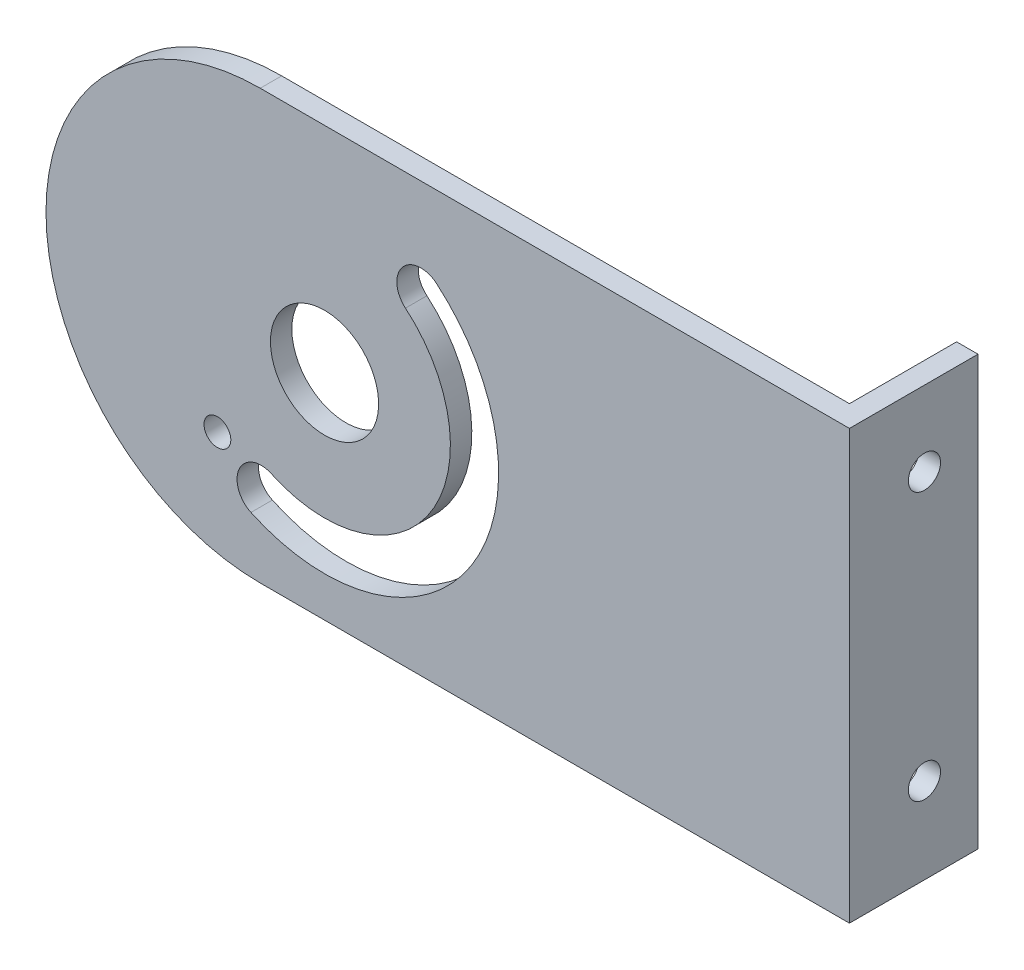
ISO-10303-21;
HEADER;
FILE_DESCRIPTION(('STEP AP214'),'2;1');
FILE_NAME('part.step','',(''),(''),'','','');
FILE_SCHEMA(('AUTOMOTIVE_DESIGN { 1 0 10303 214 1 1 1 1 }'));
ENDSEC;
DATA;
#1=APPLICATION_CONTEXT('core data for automotive mechanical design processes');
#2=APPLICATION_PROTOCOL_DEFINITION('international standard','automotive_design',2000,#1);
#3=PRODUCT_CONTEXT('',#1,'mechanical');
#4=PRODUCT('Part','Part','',(#3));
#5=PRODUCT_RELATED_PRODUCT_CATEGORY('part','',(#4));
#6=PRODUCT_DEFINITION_FORMATION('','',#4);
#7=PRODUCT_DEFINITION_CONTEXT('part definition',#1,'design');
#8=PRODUCT_DEFINITION('design','',#6,#7);
#9=PRODUCT_DEFINITION_SHAPE('','',#8);
#10=(LENGTH_UNIT() NAMED_UNIT(*) SI_UNIT(.MILLI.,.METRE.));
#11=(NAMED_UNIT(*) PLANE_ANGLE_UNIT() SI_UNIT($,.RADIAN.));
#12=(NAMED_UNIT(*) SI_UNIT($,.STERADIAN.) SOLID_ANGLE_UNIT());
#13=UNCERTAINTY_MEASURE_WITH_UNIT(LENGTH_MEASURE(1.E-05),#10,'distance_accuracy_value','');
#14=(GEOMETRIC_REPRESENTATION_CONTEXT(3) GLOBAL_UNCERTAINTY_ASSIGNED_CONTEXT((#13)) GLOBAL_UNIT_ASSIGNED_CONTEXT((#10,
#11,#12)) REPRESENTATION_CONTEXT('',''));
#15=CARTESIAN_POINT('',(0.,0.,0.));
#16=DIRECTION('',(0.,0.,1.));
#17=DIRECTION('',(1.,0.,0.));
#18=AXIS2_PLACEMENT_3D('',#15,#16,#17);
#19=CARTESIAN_POINT('',(75.,0.,2.));
#20=DIRECTION('',(0.,1.,0.));
#21=DIRECTION('',(-1.,0.,0.));
#22=AXIS2_PLACEMENT_3D('',#19,#20,#21);
#23=PLANE('',#22);
#24=DIRECTION('',(1.,0.,0.));
#25=VECTOR('',#24,1.);
#26=CARTESIAN_POINT('',(75.,0.,2.));
#27=LINE('',#26,#25);
#28=CARTESIAN_POINT('',(20.,0.,2.));
#29=VERTEX_POINT('',#28);
#30=CARTESIAN_POINT('',(75.,0.,2.));
#31=VERTEX_POINT('',#30);
#32=EDGE_CURVE('E212',#29,#31,#27,.T.);
#33=ORIENTED_EDGE('',*,*,#32,.F.);
#34=DIRECTION('',(0.,0.,-1.));
#35=VECTOR('',#34,1.);
#36=CARTESIAN_POINT('',(20.,0.,2.));
#37=LINE('',#36,#35);
#38=CARTESIAN_POINT('',(20.,0.,0.));
#39=VERTEX_POINT('',#38);
#40=EDGE_CURVE('E139',#29,#39,#37,.T.);
#41=ORIENTED_EDGE('',*,*,#40,.T.);
#42=DIRECTION('',(1.,0.,0.));
#43=VECTOR('',#42,1.);
#44=CARTESIAN_POINT('',(75.,0.,0.));
#45=LINE('',#44,#43);
#46=CARTESIAN_POINT('',(73.,0.,0.));
#47=VERTEX_POINT('',#46);
#48=EDGE_CURVE('E209',#39,#47,#45,.T.);
#49=ORIENTED_EDGE('',*,*,#48,.T.);
#50=DIRECTION('',(0.,0.,1.));
#51=VECTOR('',#50,1.);
#52=CARTESIAN_POINT('',(73.,0.,-10.));
#53=LINE('',#52,#51);
#54=CARTESIAN_POINT('',(73.,0.,-10.));
#55=VERTEX_POINT('',#54);
#56=EDGE_CURVE('E145',#55,#47,#53,.T.);
#57=ORIENTED_EDGE('',*,*,#56,.F.);
#58=DIRECTION('',(-1.,0.,0.));
#59=VECTOR('',#58,1.);
#60=CARTESIAN_POINT('',(75.,0.,-10.));
#61=LINE('',#60,#59);
#62=CARTESIAN_POINT('',(75.,0.,-10.));
#63=VERTEX_POINT('',#62);
#64=EDGE_CURVE('E144',#63,#55,#61,.T.);
#65=ORIENTED_EDGE('',*,*,#64,.F.);
#66=DIRECTION('',(0.,0.,-1.));
#67=VECTOR('',#66,1.);
#68=CARTESIAN_POINT('',(75.,0.,2.));
#69=LINE('',#68,#67);
#70=EDGE_CURVE('E128',#31,#63,#69,.T.);
#71=ORIENTED_EDGE('',*,*,#70,.F.);
#72=EDGE_LOOP('',(#33,#41,#49,#57,#65,#71));
#73=FACE_BOUND('',#72,.T.);
#74=ADVANCED_FACE('F43',(#73),#23,.F.);
#75=CARTESIAN_POINT('',(75.,40.,2.));
#76=DIRECTION('',(-1.,0.,0.));
#77=DIRECTION('',(0.,0.,1.));
#78=AXIS2_PLACEMENT_3D('',#75,#76,#77);
#79=PLANE('',#78);
#80=CARTESIAN_POINT('',(75.,33.,-5.));
#81=DIRECTION('',(-1.,0.,0.));
#82=DIRECTION('',(0.,0.,1.));
#83=AXIS2_PLACEMENT_3D('',#80,#81,#82);
#84=CIRCLE('',#83,1.5);
#85=CARTESIAN_POINT('',(75.,33.,-3.5));
#86=VERTEX_POINT('',#85);
#87=EDGE_CURVE('E154',#86,#86,#84,.T.);
#88=ORIENTED_EDGE('',*,*,#87,.T.);
#89=EDGE_LOOP('',(#88));
#90=FACE_BOUND('',#89,.T.);
#91=CARTESIAN_POINT('',(75.,8.,-5.));
#92=DIRECTION('',(-1.,0.,0.));
#93=DIRECTION('',(0.,0.,1.));
#94=AXIS2_PLACEMENT_3D('',#91,#92,#93);
#95=CIRCLE('',#94,1.5);
#96=CARTESIAN_POINT('',(75.,8.,-3.5));
#97=VERTEX_POINT('',#96);
#98=EDGE_CURVE('E160',#97,#97,#95,.T.);
#99=ORIENTED_EDGE('',*,*,#98,.T.);
#100=EDGE_LOOP('',(#99));
#101=FACE_BOUND('',#100,.T.);
#102=ORIENTED_EDGE('',*,*,#70,.T.);
#103=DIRECTION('',(0.,-1.,0.));
#104=VECTOR('',#103,1.);
#105=CARTESIAN_POINT('',(75.,0.,-10.));
#106=LINE('',#105,#104);
#107=CARTESIAN_POINT('',(75.,40.,-10.));
#108=VERTEX_POINT('',#107);
#109=EDGE_CURVE('E131',#108,#63,#106,.T.);
#110=ORIENTED_EDGE('',*,*,#109,.F.);
#111=DIRECTION('',(0.,0.,-1.));
#112=VECTOR('',#111,1.);
#113=CARTESIAN_POINT('',(75.,40.,2.));
#114=LINE('',#113,#112);
#115=CARTESIAN_POINT('',(75.,40.,2.));
#116=VERTEX_POINT('',#115);
#117=EDGE_CURVE('E136',#116,#108,#114,.T.);
#118=ORIENTED_EDGE('',*,*,#117,.F.);
#119=DIRECTION('',(0.,1.,0.));
#120=VECTOR('',#119,1.);
#121=CARTESIAN_POINT('',(75.,40.,2.));
#122=LINE('',#121,#120);
#123=EDGE_CURVE('E133',#31,#116,#122,.T.);
#124=ORIENTED_EDGE('',*,*,#123,.F.);
#125=EDGE_LOOP('',(#102,#110,#118,#124));
#126=FACE_BOUND('',#125,.T.);
#127=ADVANCED_FACE('F132',(#90,#101,#126),#79,.F.);
#128=CARTESIAN_POINT('',(0.,40.,2.));
#129=DIRECTION('',(0.,-1.,0.));
#130=DIRECTION('',(0.,0.,-1.));
#131=AXIS2_PLACEMENT_3D('',#128,#129,#130);
#132=PLANE('',#131);
#133=ORIENTED_EDGE('',*,*,#117,.T.);
#134=DIRECTION('',(1.,0.,0.));
#135=VECTOR('',#134,1.);
#136=CARTESIAN_POINT('',(75.,40.,-10.));
#137=LINE('',#136,#135);
#138=CARTESIAN_POINT('',(73.,40.,-10.));
#139=VERTEX_POINT('',#138);
#140=EDGE_CURVE('E155',#139,#108,#137,.T.);
#141=ORIENTED_EDGE('',*,*,#140,.F.);
#142=DIRECTION('',(0.,0.,1.));
#143=VECTOR('',#142,1.);
#144=CARTESIAN_POINT('',(73.,40.,-10.));
#145=LINE('',#144,#143);
#146=CARTESIAN_POINT('',(73.,40.,0.));
#147=VERTEX_POINT('',#146);
#148=EDGE_CURVE('E162',#139,#147,#145,.T.);
#149=ORIENTED_EDGE('',*,*,#148,.T.);
#150=DIRECTION('',(-1.,0.,0.));
#151=VECTOR('',#150,1.);
#152=CARTESIAN_POINT('',(0.,40.,0.));
#153=LINE('',#152,#151);
#154=CARTESIAN_POINT('',(20.,40.,0.));
#155=VERTEX_POINT('',#154);
#156=EDGE_CURVE('E214',#147,#155,#153,.T.);
#157=ORIENTED_EDGE('',*,*,#156,.T.);
#158=DIRECTION('',(0.,0.,-1.));
#159=VECTOR('',#158,1.);
#160=CARTESIAN_POINT('',(20.,40.,2.));
#161=LINE('',#160,#159);
#162=CARTESIAN_POINT('',(20.,40.,2.));
#163=VERTEX_POINT('',#162);
#164=EDGE_CURVE('E11',#155,#163,#161,.F.);
#165=ORIENTED_EDGE('',*,*,#164,.T.);
#166=DIRECTION('',(-1.,0.,0.));
#167=VECTOR('',#166,1.);
#168=CARTESIAN_POINT('',(0.,40.,2.));
#169=LINE('',#168,#167);
#170=EDGE_CURVE('E213',#116,#163,#169,.T.);
#171=ORIENTED_EDGE('',*,*,#170,.F.);
#172=EDGE_LOOP('',(#133,#141,#149,#157,#165,#171));
#173=FACE_BOUND('',#172,.T.);
#174=ADVANCED_FACE('F243',(#173),#132,.F.);
#175=CARTESIAN_POINT('',(0.,0.,2.));
#176=DIRECTION('',(0.,0.,-1.));
#177=DIRECTION('',(-1.,0.,0.));
#178=AXIS2_PLACEMENT_3D('',#175,#176,#177);
#179=PLANE('',#178);
#180=CARTESIAN_POINT('',(16.,10.2020410288673,2.));
#181=DIRECTION('',(0.,0.,-1.));
#182=DIRECTION('',(-1.,0.,0.));
#183=AXIS2_PLACEMENT_3D('',#180,#181,#182);
#184=CIRCLE('',#183,1.25);
#185=CARTESIAN_POINT('',(14.75,10.2020410288673,2.));
#186=VERTEX_POINT('',#185);
#187=EDGE_CURVE('E205',#186,#186,#184,.T.);
#188=ORIENTED_EDGE('',*,*,#187,.T.);
#189=EDGE_LOOP('',(#188));
#190=FACE_BOUND('',#189,.T.);
#191=CARTESIAN_POINT('',(26.,20.,2.));
#192=DIRECTION('',(0.,0.,1.));
#193=DIRECTION('',(-1.,0.,0.));
#194=AXIS2_PLACEMENT_3D('',#191,#192,#193);
#195=CIRCLE('',#194,11.75);
#196=CARTESIAN_POINT('',(21.0332687973885,9.35133430137817,2.));
#197=VERTEX_POINT('',#196);
#198=CARTESIAN_POINT('',(33.5535714285714,29.0003365866766,2.));
#199=VERTEX_POINT('',#198);
#200=EDGE_CURVE('E170',#197,#199,#195,.T.);
#201=ORIENTED_EDGE('',*,*,#200,.T.);
#202=CARTESIAN_POINT('',(35.,30.7238052947636,2.));
#203=DIRECTION('',(0.,0.,-1.));
#204=DIRECTION('',(-1.,0.,0.));
#205=AXIS2_PLACEMENT_3D('',#202,#203,#204);
#206=CIRCLE('',#205,2.25000000000001);
#207=CARTESIAN_POINT('',(36.4464285714286,32.4472740028506,2.));
#208=VERTEX_POINT('',#207);
#209=EDGE_CURVE('E183',#199,#208,#206,.T.);
#210=ORIENTED_EDGE('',*,*,#209,.T.);
#211=CARTESIAN_POINT('',(26.,20.,2.));
#212=DIRECTION('',(0.,0.,-1.));
#213=DIRECTION('',(-1.,0.,0.));
#214=AXIS2_PLACEMENT_3D('',#211,#212,#213);
#215=CIRCLE('',#214,16.25);
#216=CARTESIAN_POINT('',(19.1311164219202,5.27312190616129,2.));
#217=VERTEX_POINT('',#216);
#218=EDGE_CURVE('E194',#208,#217,#215,.T.);
#219=ORIENTED_EDGE('',*,*,#218,.T.);
#220=CARTESIAN_POINT('',(20.0821926096544,7.31222810376973,2.));
#221=DIRECTION('',(0.,0.,-1.));
#222=DIRECTION('',(-1.,0.,0.));
#223=AXIS2_PLACEMENT_3D('',#220,#221,#222);
#224=CIRCLE('',#223,2.25000000000001);
#225=EDGE_CURVE('E195',#217,#197,#224,.T.);
#226=ORIENTED_EDGE('',*,*,#225,.T.);
#227=EDGE_LOOP('',(#201,#210,#219,#226));
#228=FACE_BOUND('',#227,.T.);
#229=CARTESIAN_POINT('',(26.,20.,2.));
#230=DIRECTION('',(0.,0.,-1.));
#231=DIRECTION('',(-1.,0.,0.));
#232=AXIS2_PLACEMENT_3D('',#229,#230,#231);
#233=CIRCLE('',#232,5.05);
#234=CARTESIAN_POINT('',(20.95,20.,2.));
#235=VERTEX_POINT('',#234);
#236=EDGE_CURVE('E204',#235,#235,#233,.T.);
#237=ORIENTED_EDGE('',*,*,#236,.T.);
#238=EDGE_LOOP('',(#237));
#239=FACE_BOUND('',#238,.T.);
#240=CARTESIAN_POINT('',(20.,20.,2.));
#241=DIRECTION('',(0.,0.,-1.));
#242=DIRECTION('',(-1.,0.,0.));
#243=AXIS2_PLACEMENT_3D('',#240,#241,#242);
#244=CIRCLE('',#243,20.);
#245=CARTESIAN_POINT('',(0.,20.,2.));
#246=VERTEX_POINT('',#245);
#247=EDGE_CURVE('E69',#163,#246,#244,.F.);
#248=ORIENTED_EDGE('',*,*,#247,.T.);
#249=CARTESIAN_POINT('',(20.,20.,2.));
#250=DIRECTION('',(0.,0.,-1.));
#251=DIRECTION('',(-1.,0.,0.));
#252=AXIS2_PLACEMENT_3D('',#249,#250,#251);
#253=CIRCLE('',#252,20.);
#254=EDGE_CURVE('E55',#246,#29,#253,.F.);
#255=ORIENTED_EDGE('',*,*,#254,.T.);
#256=ORIENTED_EDGE('',*,*,#32,.T.);
#257=ORIENTED_EDGE('',*,*,#123,.T.);
#258=ORIENTED_EDGE('',*,*,#170,.T.);
#259=EDGE_LOOP('',(#248,#255,#256,#257,#258));
#260=FACE_BOUND('',#259,.T.);
#261=ADVANCED_FACE('F229',(#190,#228,#239,#260),#179,.F.);
#262=CARTESIAN_POINT('',(0.,0.,0.));
#263=DIRECTION('',(0.,0.,-1.));
#264=DIRECTION('',(-1.,0.,0.));
#265=AXIS2_PLACEMENT_3D('',#262,#263,#264);
#266=PLANE('',#265);
#267=DIRECTION('',(0.,1.,0.));
#268=VECTOR('',#267,1.);
#269=CARTESIAN_POINT('',(73.,0.,0.));
#270=LINE('',#269,#268);
#271=EDGE_CURVE('E56',#47,#147,#270,.T.);
#272=ORIENTED_EDGE('',*,*,#271,.F.);
#273=ORIENTED_EDGE('',*,*,#48,.F.);
#274=CARTESIAN_POINT('',(20.,20.,0.));
#275=DIRECTION('',(0.,0.,-1.));
#276=DIRECTION('',(-1.,0.,0.));
#277=AXIS2_PLACEMENT_3D('',#274,#275,#276);
#278=CIRCLE('',#277,20.);
#279=CARTESIAN_POINT('',(0.,20.,0.));
#280=VERTEX_POINT('',#279);
#281=EDGE_CURVE('E221',#39,#280,#278,.T.);
#282=ORIENTED_EDGE('',*,*,#281,.T.);
#283=CARTESIAN_POINT('',(20.,20.,0.));
#284=DIRECTION('',(0.,0.,-1.));
#285=DIRECTION('',(-1.,0.,0.));
#286=AXIS2_PLACEMENT_3D('',#283,#284,#285);
#287=CIRCLE('',#286,20.);
#288=EDGE_CURVE('E224',#280,#155,#287,.T.);
#289=ORIENTED_EDGE('',*,*,#288,.T.);
#290=ORIENTED_EDGE('',*,*,#156,.F.);
#291=EDGE_LOOP('',(#272,#273,#282,#289,#290));
#292=FACE_BOUND('',#291,.T.);
#293=CARTESIAN_POINT('',(16.,10.2020410288673,0.));
#294=DIRECTION('',(0.,0.,-1.));
#295=DIRECTION('',(-1.,0.,0.));
#296=AXIS2_PLACEMENT_3D('',#293,#294,#295);
#297=CIRCLE('',#296,1.25);
#298=CARTESIAN_POINT('',(14.75,10.2020410288673,0.));
#299=VERTEX_POINT('',#298);
#300=EDGE_CURVE('E178',#299,#299,#297,.T.);
#301=ORIENTED_EDGE('',*,*,#300,.F.);
#302=EDGE_LOOP('',(#301));
#303=FACE_BOUND('',#302,.T.);
#304=CARTESIAN_POINT('',(35.,30.7238052947636,0.));
#305=DIRECTION('',(0.,0.,-1.));
#306=DIRECTION('',(-1.,0.,0.));
#307=AXIS2_PLACEMENT_3D('',#304,#305,#306);
#308=CIRCLE('',#307,2.25000000000001);
#309=CARTESIAN_POINT('',(33.5535714285714,29.0003365866766,0.));
#310=VERTEX_POINT('',#309);
#311=CARTESIAN_POINT('',(36.4464285714286,32.4472740028506,0.));
#312=VERTEX_POINT('',#311);
#313=EDGE_CURVE('E190',#310,#312,#308,.T.);
#314=ORIENTED_EDGE('',*,*,#313,.F.);
#315=CARTESIAN_POINT('',(26.,20.,0.));
#316=DIRECTION('',(0.,0.,1.));
#317=DIRECTION('',(-1.,0.,0.));
#318=AXIS2_PLACEMENT_3D('',#315,#316,#317);
#319=CIRCLE('',#318,11.75);
#320=CARTESIAN_POINT('',(21.0332687973885,9.35133430137817,0.));
#321=VERTEX_POINT('',#320);
#322=EDGE_CURVE('E180',#321,#310,#319,.T.);
#323=ORIENTED_EDGE('',*,*,#322,.F.);
#324=CARTESIAN_POINT('',(20.0821926096544,7.31222810376973,0.));
#325=DIRECTION('',(0.,0.,-1.));
#326=DIRECTION('',(-1.,0.,0.));
#327=AXIS2_PLACEMENT_3D('',#324,#325,#326);
#328=CIRCLE('',#327,2.25000000000001);
#329=CARTESIAN_POINT('',(19.1311164219202,5.27312190616129,0.));
#330=VERTEX_POINT('',#329);
#331=EDGE_CURVE('E177',#330,#321,#328,.T.);
#332=ORIENTED_EDGE('',*,*,#331,.F.);
#333=CARTESIAN_POINT('',(26.,20.,0.));
#334=DIRECTION('',(0.,0.,-1.));
#335=DIRECTION('',(-1.,0.,0.));
#336=AXIS2_PLACEMENT_3D('',#333,#334,#335);
#337=CIRCLE('',#336,16.25);
#338=EDGE_CURVE('E185',#312,#330,#337,.T.);
#339=ORIENTED_EDGE('',*,*,#338,.F.);
#340=EDGE_LOOP('',(#314,#323,#332,#339));
#341=FACE_BOUND('',#340,.T.);
#342=CARTESIAN_POINT('',(26.,20.,0.));
#343=DIRECTION('',(0.,0.,-1.));
#344=DIRECTION('',(-1.,0.,0.));
#345=AXIS2_PLACEMENT_3D('',#342,#343,#344);
#346=CIRCLE('',#345,5.05);
#347=CARTESIAN_POINT('',(20.95,20.,0.));
#348=VERTEX_POINT('',#347);
#349=EDGE_CURVE('E189',#348,#348,#346,.T.);
#350=ORIENTED_EDGE('',*,*,#349,.F.);
#351=EDGE_LOOP('',(#350));
#352=FACE_BOUND('',#351,.T.);
#353=ADVANCED_FACE('F233',(#292,#303,#341,#352),#266,.T.);
#354=CARTESIAN_POINT('',(26.,20.,2.));
#355=DIRECTION('',(0.,0.,-1.));
#356=DIRECTION('',(-1.,0.,0.));
#357=AXIS2_PLACEMENT_3D('',#354,#355,#356);
#358=CYLINDRICAL_SURFACE('',#357,5.05);
#359=ORIENTED_EDGE('',*,*,#236,.F.);
#360=EDGE_LOOP('',(#359));
#361=FACE_BOUND('',#360,.T.);
#362=ORIENTED_EDGE('',*,*,#349,.T.);
#363=EDGE_LOOP('',(#362));
#364=FACE_BOUND('',#363,.T.);
#365=ADVANCED_FACE('F269',(#361,#364),#358,.F.);
#366=CARTESIAN_POINT('',(35.,30.7238052947636,2.));
#367=DIRECTION('',(0.,0.,-1.));
#368=DIRECTION('',(-1.,0.,0.));
#369=AXIS2_PLACEMENT_3D('',#366,#367,#368);
#370=CYLINDRICAL_SURFACE('',#369,2.25000000000001);
#371=ORIENTED_EDGE('',*,*,#313,.T.);
#372=DIRECTION('',(0.,0.,-1.));
#373=VECTOR('',#372,1.);
#374=CARTESIAN_POINT('',(36.4464285714286,32.4472740028506,2.));
#375=LINE('',#374,#373);
#376=EDGE_CURVE('E168',#208,#312,#375,.T.);
#377=ORIENTED_EDGE('',*,*,#376,.F.);
#378=ORIENTED_EDGE('',*,*,#209,.F.);
#379=DIRECTION('',(0.,0.,-1.));
#380=VECTOR('',#379,1.);
#381=CARTESIAN_POINT('',(33.5535714285714,29.0003365866766,2.));
#382=LINE('',#381,#380);
#383=EDGE_CURVE('E175',#199,#310,#382,.T.);
#384=ORIENTED_EDGE('',*,*,#383,.T.);
#385=EDGE_LOOP('',(#371,#377,#378,#384));
#386=FACE_BOUND('',#385,.T.);
#387=ADVANCED_FACE('F276',(#386),#370,.F.);
#388=CARTESIAN_POINT('',(26.,20.,2.));
#389=DIRECTION('',(0.,0.,-1.));
#390=DIRECTION('',(-1.,0.,0.));
#391=AXIS2_PLACEMENT_3D('',#388,#389,#390);
#392=CYLINDRICAL_SURFACE('',#391,11.75);
#393=ORIENTED_EDGE('',*,*,#322,.T.);
#394=ORIENTED_EDGE('',*,*,#383,.F.);
#395=ORIENTED_EDGE('',*,*,#200,.F.);
#396=DIRECTION('',(0.,0.,-1.));
#397=VECTOR('',#396,1.);
#398=CARTESIAN_POINT('',(21.0332687973885,9.35133430137817,2.));
#399=LINE('',#398,#397);
#400=EDGE_CURVE('E174',#197,#321,#399,.T.);
#401=ORIENTED_EDGE('',*,*,#400,.T.);
#402=EDGE_LOOP('',(#393,#394,#395,#401));
#403=FACE_BOUND('',#402,.T.);
#404=ADVANCED_FACE('F284',(#403),#392,.T.);
#405=CARTESIAN_POINT('',(20.0821926096544,7.31222810376973,2.));
#406=DIRECTION('',(0.,0.,-1.));
#407=DIRECTION('',(-1.,0.,0.));
#408=AXIS2_PLACEMENT_3D('',#405,#406,#407);
#409=CYLINDRICAL_SURFACE('',#408,2.25000000000001);
#410=ORIENTED_EDGE('',*,*,#331,.T.);
#411=ORIENTED_EDGE('',*,*,#400,.F.);
#412=ORIENTED_EDGE('',*,*,#225,.F.);
#413=DIRECTION('',(0.,0.,-1.));
#414=VECTOR('',#413,1.);
#415=CARTESIAN_POINT('',(19.1311164219202,5.27312190616129,2.));
#416=LINE('',#415,#414);
#417=EDGE_CURVE('E166',#217,#330,#416,.T.);
#418=ORIENTED_EDGE('',*,*,#417,.T.);
#419=EDGE_LOOP('',(#410,#411,#412,#418));
#420=FACE_BOUND('',#419,.T.);
#421=ADVANCED_FACE('F287',(#420),#409,.F.);
#422=CARTESIAN_POINT('',(26.,20.,2.));
#423=DIRECTION('',(0.,0.,-1.));
#424=DIRECTION('',(-1.,0.,0.));
#425=AXIS2_PLACEMENT_3D('',#422,#423,#424);
#426=CYLINDRICAL_SURFACE('',#425,16.25);
#427=ORIENTED_EDGE('',*,*,#338,.T.);
#428=ORIENTED_EDGE('',*,*,#417,.F.);
#429=ORIENTED_EDGE('',*,*,#218,.F.);
#430=ORIENTED_EDGE('',*,*,#376,.T.);
#431=EDGE_LOOP('',(#427,#428,#429,#430));
#432=FACE_BOUND('',#431,.T.);
#433=ADVANCED_FACE('F282',(#432),#426,.F.);
#434=CARTESIAN_POINT('',(16.,10.2020410288673,2.));
#435=DIRECTION('',(0.,0.,-1.));
#436=DIRECTION('',(-1.,0.,0.));
#437=AXIS2_PLACEMENT_3D('',#434,#435,#436);
#438=CYLINDRICAL_SURFACE('',#437,1.25);
#439=ORIENTED_EDGE('',*,*,#187,.F.);
#440=EDGE_LOOP('',(#439));
#441=FACE_BOUND('',#440,.T.);
#442=ORIENTED_EDGE('',*,*,#300,.T.);
#443=EDGE_LOOP('',(#442));
#444=FACE_BOUND('',#443,.T.);
#445=ADVANCED_FACE('F277',(#441,#444),#438,.F.);
#446=CARTESIAN_POINT('',(20.,20.,2.));
#447=DIRECTION('',(0.,0.,-1.));
#448=DIRECTION('',(-1.,0.,0.));
#449=AXIS2_PLACEMENT_3D('',#446,#447,#448);
#450=CYLINDRICAL_SURFACE('',#449,20.);
#451=DIRECTION('',(0.,0.,-1.));
#452=VECTOR('',#451,1.);
#453=CARTESIAN_POINT('',(0.,20.,2.));
#454=LINE('',#453,#452);
#455=EDGE_CURVE('E50',#246,#280,#454,.T.);
#456=ORIENTED_EDGE('',*,*,#455,.F.);
#457=ORIENTED_EDGE('',*,*,#247,.F.);
#458=ORIENTED_EDGE('',*,*,#164,.F.);
#459=ORIENTED_EDGE('',*,*,#288,.F.);
#460=EDGE_LOOP('',(#456,#457,#458,#459));
#461=FACE_BOUND('',#460,.T.);
#462=ADVANCED_FACE('F44',(#461),#450,.T.);
#463=CARTESIAN_POINT('',(20.,20.,2.));
#464=DIRECTION('',(0.,0.,-1.));
#465=DIRECTION('',(-1.,0.,0.));
#466=AXIS2_PLACEMENT_3D('',#463,#464,#465);
#467=CYLINDRICAL_SURFACE('',#466,20.);
#468=ORIENTED_EDGE('',*,*,#254,.F.);
#469=ORIENTED_EDGE('',*,*,#455,.T.);
#470=ORIENTED_EDGE('',*,*,#281,.F.);
#471=ORIENTED_EDGE('',*,*,#40,.F.);
#472=EDGE_LOOP('',(#468,#469,#470,#471));
#473=FACE_BOUND('',#472,.T.);
#474=ADVANCED_FACE('F231',(#473),#467,.T.);
#475=CARTESIAN_POINT('',(73.,0.,-10.));
#476=DIRECTION('',(1.,0.,0.));
#477=DIRECTION('',(0.,0.,-1.));
#478=AXIS2_PLACEMENT_3D('',#475,#476,#477);
#479=PLANE('',#478);
#480=CARTESIAN_POINT('',(73.,33.,-5.));
#481=DIRECTION('',(-1.,0.,0.));
#482=DIRECTION('',(0.,0.,1.));
#483=AXIS2_PLACEMENT_3D('',#480,#481,#482);
#484=CIRCLE('',#483,1.5);
#485=CARTESIAN_POINT('',(73.,33.,-3.5));
#486=VERTEX_POINT('',#485);
#487=EDGE_CURVE('E410',#486,#486,#484,.T.);
#488=ORIENTED_EDGE('',*,*,#487,.F.);
#489=EDGE_LOOP('',(#488));
#490=FACE_BOUND('',#489,.T.);
#491=CARTESIAN_POINT('',(73.,8.,-5.));
#492=DIRECTION('',(-1.,0.,0.));
#493=DIRECTION('',(0.,0.,1.));
#494=AXIS2_PLACEMENT_3D('',#491,#492,#493);
#495=CIRCLE('',#494,1.5);
#496=CARTESIAN_POINT('',(73.,8.,-3.5));
#497=VERTEX_POINT('',#496);
#498=EDGE_CURVE('E409',#497,#497,#495,.T.);
#499=ORIENTED_EDGE('',*,*,#498,.F.);
#500=EDGE_LOOP('',(#499));
#501=FACE_BOUND('',#500,.T.);
#502=ORIENTED_EDGE('',*,*,#271,.T.);
#503=ORIENTED_EDGE('',*,*,#148,.F.);
#504=DIRECTION('',(0.,1.,0.));
#505=VECTOR('',#504,1.);
#506=CARTESIAN_POINT('',(73.,0.,-10.));
#507=LINE('',#506,#505);
#508=EDGE_CURVE('E149',#55,#139,#507,.T.);
#509=ORIENTED_EDGE('',*,*,#508,.F.);
#510=ORIENTED_EDGE('',*,*,#56,.T.);
#511=EDGE_LOOP('',(#502,#503,#509,#510));
#512=FACE_BOUND('',#511,.T.);
#513=ADVANCED_FACE('F245',(#490,#501,#512),#479,.F.);
#514=CARTESIAN_POINT('',(0.,0.,-10.));
#515=DIRECTION('',(0.,0.,1.));
#516=DIRECTION('',(1.,0.,0.));
#517=AXIS2_PLACEMENT_3D('',#514,#515,#516);
#518=PLANE('',#517);
#519=ORIENTED_EDGE('',*,*,#109,.T.);
#520=ORIENTED_EDGE('',*,*,#64,.T.);
#521=ORIENTED_EDGE('',*,*,#508,.T.);
#522=ORIENTED_EDGE('',*,*,#140,.T.);
#523=EDGE_LOOP('',(#519,#520,#521,#522));
#524=FACE_BOUND('',#523,.T.);
#525=ADVANCED_FACE('F146',(#524),#518,.F.);
#526=CARTESIAN_POINT('',(75.,8.,-5.));
#527=DIRECTION('',(-1.,0.,0.));
#528=DIRECTION('',(0.,0.,1.));
#529=AXIS2_PLACEMENT_3D('',#526,#527,#528);
#530=CYLINDRICAL_SURFACE('',#529,1.5);
#531=ORIENTED_EDGE('',*,*,#98,.F.);
#532=EDGE_LOOP('',(#531));
#533=FACE_BOUND('',#532,.T.);
#534=ORIENTED_EDGE('',*,*,#498,.T.);
#535=EDGE_LOOP('',(#534));
#536=FACE_BOUND('',#535,.T.);
#537=ADVANCED_FACE('F251',(#533,#536),#530,.F.);
#538=CARTESIAN_POINT('',(75.,33.,-5.));
#539=DIRECTION('',(-1.,0.,0.));
#540=DIRECTION('',(0.,0.,1.));
#541=AXIS2_PLACEMENT_3D('',#538,#539,#540);
#542=CYLINDRICAL_SURFACE('',#541,1.5);
#543=ORIENTED_EDGE('',*,*,#87,.F.);
#544=EDGE_LOOP('',(#543));
#545=FACE_BOUND('',#544,.T.);
#546=ORIENTED_EDGE('',*,*,#487,.T.);
#547=EDGE_LOOP('',(#546));
#548=FACE_BOUND('',#547,.T.);
#549=ADVANCED_FACE('F394',(#545,#548),#542,.F.);
#550=CLOSED_SHELL('',(#74,#127,#174,#261,#353,#365,#387,#404,#421,#433,#445,#462,#474,#513,#525,
#537,#549));
#551=MANIFOLD_SOLID_BREP('B2',#550);
#552=ADVANCED_BREP_SHAPE_REPRESENTATION('',(#18,#551),#14);
#553=SHAPE_DEFINITION_REPRESENTATION(#9,#552);
ENDSEC;
END-ISO-10303-21;
